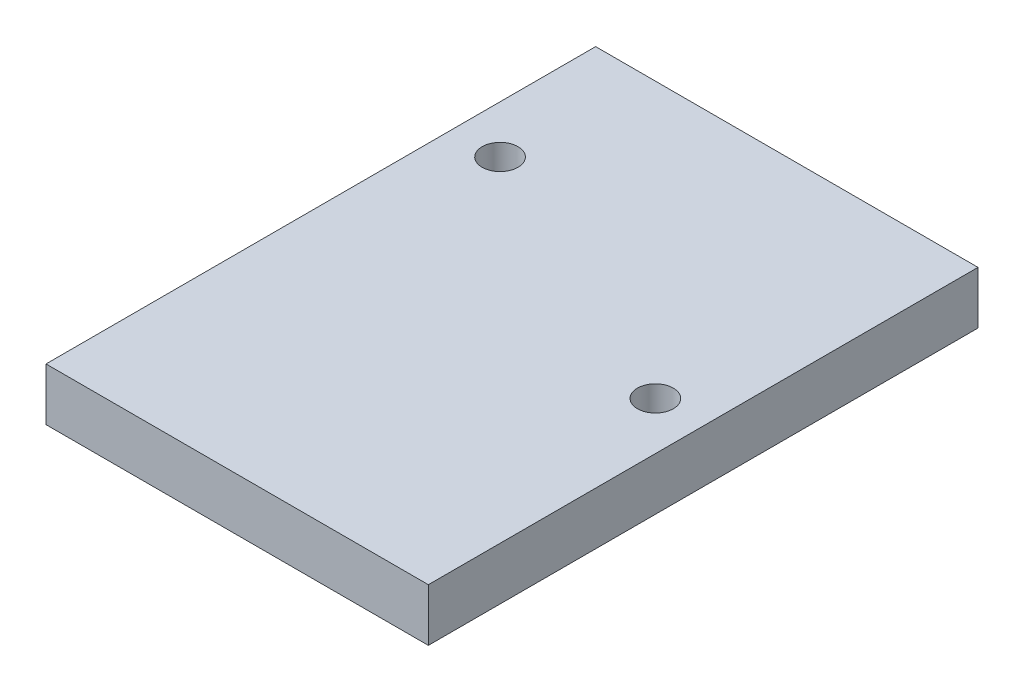
ISO-10303-21;
HEADER;
FILE_DESCRIPTION(('STEP AP214'),'2;1');
FILE_NAME('part.step','',(''),(''),'','','');
FILE_SCHEMA(('AUTOMOTIVE_DESIGN { 1 0 10303 214 1 1 1 1 }'));
ENDSEC;
DATA;
#1=APPLICATION_CONTEXT('core data for automotive mechanical design processes');
#2=APPLICATION_PROTOCOL_DEFINITION('international standard','automotive_design',2000,#1);
#3=PRODUCT_CONTEXT('',#1,'mechanical');
#4=PRODUCT('Part','Part','',(#3));
#5=PRODUCT_RELATED_PRODUCT_CATEGORY('part','',(#4));
#6=PRODUCT_DEFINITION_FORMATION('','',#4);
#7=PRODUCT_DEFINITION_CONTEXT('part definition',#1,'design');
#8=PRODUCT_DEFINITION('design','',#6,#7);
#9=PRODUCT_DEFINITION_SHAPE('','',#8);
#10=(LENGTH_UNIT() NAMED_UNIT(*) SI_UNIT(.MILLI.,.METRE.));
#11=(NAMED_UNIT(*) PLANE_ANGLE_UNIT() SI_UNIT($,.RADIAN.));
#12=(NAMED_UNIT(*) SI_UNIT($,.STERADIAN.) SOLID_ANGLE_UNIT());
#13=UNCERTAINTY_MEASURE_WITH_UNIT(LENGTH_MEASURE(1.E-05),#10,'distance_accuracy_value','');
#14=(GEOMETRIC_REPRESENTATION_CONTEXT(3) GLOBAL_UNCERTAINTY_ASSIGNED_CONTEXT((#13)) GLOBAL_UNIT_ASSIGNED_CONTEXT((#10,
#11,#12)) REPRESENTATION_CONTEXT('',''));
#15=CARTESIAN_POINT('',(0.,0.,0.));
#16=DIRECTION('',(0.,0.,1.));
#17=DIRECTION('',(1.,0.,0.));
#18=AXIS2_PLACEMENT_3D('',#15,#16,#17);
#19=CARTESIAN_POINT('',(0.,2.2,0.));
#20=DIRECTION('',(0.,-1.,0.));
#21=DIRECTION('',(0.,0.,-1.));
#22=AXIS2_PLACEMENT_3D('',#19,#20,#21);
#23=PLANE('',#22);
#24=DIRECTION('',(1.,0.,0.));
#25=VECTOR('',#24,1.);
#26=CARTESIAN_POINT('',(0.,2.2,0.));
#27=LINE('',#26,#25);
#28=CARTESIAN_POINT('',(0.,2.2,0.));
#29=VERTEX_POINT('',#28);
#30=CARTESIAN_POINT('',(16.,2.2,0.));
#31=VERTEX_POINT('',#30);
#32=EDGE_CURVE('E130',#29,#31,#27,.T.);
#33=ORIENTED_EDGE('',*,*,#32,.F.);
#34=DIRECTION('',(0.,0.,1.));
#35=VECTOR('',#34,1.);
#36=CARTESIAN_POINT('',(0.,2.2,0.));
#37=LINE('',#36,#35);
#38=CARTESIAN_POINT('',(0.,2.2,23.));
#39=VERTEX_POINT('',#38);
#40=EDGE_CURVE('E120',#29,#39,#37,.T.);
#41=ORIENTED_EDGE('',*,*,#40,.T.);
#42=DIRECTION('',(1.,0.,0.));
#43=VECTOR('',#42,1.);
#44=CARTESIAN_POINT('',(0.,2.2,23.));
#45=LINE('',#44,#43);
#46=CARTESIAN_POINT('',(16.,2.2,23.));
#47=VERTEX_POINT('',#46);
#48=EDGE_CURVE('E115',#39,#47,#45,.T.);
#49=ORIENTED_EDGE('',*,*,#48,.T.);
#50=DIRECTION('',(0.,0.,1.));
#51=VECTOR('',#50,1.);
#52=CARTESIAN_POINT('',(16.,2.2,0.));
#53=LINE('',#52,#51);
#54=EDGE_CURVE('E119',#31,#47,#53,.T.);
#55=ORIENTED_EDGE('',*,*,#54,.F.);
#56=EDGE_LOOP('',(#33,#41,#49,#55));
#57=FACE_BOUND('',#56,.T.);
#58=CARTESIAN_POINT('',(2.,2.2,6.));
#59=DIRECTION('',(0.,1.,0.));
#60=DIRECTION('',(0.,0.,1.));
#61=AXIS2_PLACEMENT_3D('',#58,#59,#60);
#62=CIRCLE('',#61,0.75);
#63=CARTESIAN_POINT('',(2.,2.2,6.75));
#64=VERTEX_POINT('',#63);
#65=EDGE_CURVE('E140',#64,#64,#62,.T.);
#66=ORIENTED_EDGE('',*,*,#65,.F.);
#67=EDGE_LOOP('',(#66));
#68=FACE_BOUND('',#67,.T.);
#69=CARTESIAN_POINT('',(14.,2.2,11.5));
#70=DIRECTION('',(0.,1.,0.));
#71=DIRECTION('',(0.,0.,1.));
#72=AXIS2_PLACEMENT_3D('',#69,#70,#71);
#73=CIRCLE('',#72,0.75);
#74=CARTESIAN_POINT('',(14.,2.2,12.25));
#75=VERTEX_POINT('',#74);
#76=EDGE_CURVE('E181',#75,#75,#73,.T.);
#77=ORIENTED_EDGE('',*,*,#76,.F.);
#78=EDGE_LOOP('',(#77));
#79=FACE_BOUND('',#78,.T.);
#80=ADVANCED_FACE('F69',(#57,#68,#79),#23,.F.);
#81=CARTESIAN_POINT('',(0.,0.,0.));
#82=DIRECTION('',(0.,-1.,0.));
#83=DIRECTION('',(0.,0.,-1.));
#84=AXIS2_PLACEMENT_3D('',#81,#82,#83);
#85=PLANE('',#84);
#86=CARTESIAN_POINT('',(2.,0.,6.));
#87=DIRECTION('',(0.,1.,0.));
#88=DIRECTION('',(0.,0.,1.));
#89=AXIS2_PLACEMENT_3D('',#86,#87,#88);
#90=CIRCLE('',#89,0.75);
#91=CARTESIAN_POINT('',(2.,0.,6.75));
#92=VERTEX_POINT('',#91);
#93=EDGE_CURVE('E180',#92,#92,#90,.T.);
#94=ORIENTED_EDGE('',*,*,#93,.T.);
#95=EDGE_LOOP('',(#94));
#96=FACE_BOUND('',#95,.T.);
#97=DIRECTION('',(1.,0.,0.));
#98=VECTOR('',#97,1.);
#99=CARTESIAN_POINT('',(0.,0.,0.));
#100=LINE('',#99,#98);
#101=CARTESIAN_POINT('',(0.,0.,0.));
#102=VERTEX_POINT('',#101);
#103=CARTESIAN_POINT('',(16.,0.,0.));
#104=VERTEX_POINT('',#103);
#105=EDGE_CURVE('E136',#102,#104,#100,.T.);
#106=ORIENTED_EDGE('',*,*,#105,.T.);
#107=DIRECTION('',(0.,0.,1.));
#108=VECTOR('',#107,1.);
#109=CARTESIAN_POINT('',(16.,0.,0.));
#110=LINE('',#109,#108);
#111=CARTESIAN_POINT('',(16.,0.,23.));
#112=VERTEX_POINT('',#111);
#113=EDGE_CURVE('E139',#104,#112,#110,.T.);
#114=ORIENTED_EDGE('',*,*,#113,.T.);
#115=DIRECTION('',(1.,0.,0.));
#116=VECTOR('',#115,1.);
#117=CARTESIAN_POINT('',(0.,0.,23.));
#118=LINE('',#117,#116);
#119=CARTESIAN_POINT('',(0.,0.,23.));
#120=VERTEX_POINT('',#119);
#121=EDGE_CURVE('E127',#120,#112,#118,.T.);
#122=ORIENTED_EDGE('',*,*,#121,.F.);
#123=DIRECTION('',(0.,0.,1.));
#124=VECTOR('',#123,1.);
#125=CARTESIAN_POINT('',(0.,0.,0.));
#126=LINE('',#125,#124);
#127=EDGE_CURVE('E103',#102,#120,#126,.T.);
#128=ORIENTED_EDGE('',*,*,#127,.F.);
#129=EDGE_LOOP('',(#106,#114,#122,#128));
#130=FACE_BOUND('',#129,.T.);
#131=CARTESIAN_POINT('',(14.,0.,11.5));
#132=DIRECTION('',(0.,1.,0.));
#133=DIRECTION('',(0.,0.,1.));
#134=AXIS2_PLACEMENT_3D('',#131,#132,#133);
#135=CIRCLE('',#134,0.75);
#136=CARTESIAN_POINT('',(14.,0.,12.25));
#137=VERTEX_POINT('',#136);
#138=EDGE_CURVE('E184',#137,#137,#135,.T.);
#139=ORIENTED_EDGE('',*,*,#138,.T.);
#140=EDGE_LOOP('',(#139));
#141=FACE_BOUND('',#140,.T.);
#142=ADVANCED_FACE('F145',(#96,#130,#141),#85,.T.);
#143=CARTESIAN_POINT('',(0.,2.2,0.));
#144=DIRECTION('',(0.,0.,-1.));
#145=DIRECTION('',(-1.,0.,0.));
#146=AXIS2_PLACEMENT_3D('',#143,#144,#145);
#147=PLANE('',#146);
#148=ORIENTED_EDGE('',*,*,#105,.F.);
#149=DIRECTION('',(0.,-1.,0.));
#150=VECTOR('',#149,1.);
#151=CARTESIAN_POINT('',(0.,2.2,0.));
#152=LINE('',#151,#150);
#153=EDGE_CURVE('E12',#29,#102,#152,.T.);
#154=ORIENTED_EDGE('',*,*,#153,.F.);
#155=ORIENTED_EDGE('',*,*,#32,.T.);
#156=DIRECTION('',(0.,-1.,0.));
#157=VECTOR('',#156,1.);
#158=CARTESIAN_POINT('',(16.,2.2,0.));
#159=LINE('',#158,#157);
#160=EDGE_CURVE('E73',#31,#104,#159,.T.);
#161=ORIENTED_EDGE('',*,*,#160,.T.);
#162=EDGE_LOOP('',(#148,#154,#155,#161));
#163=FACE_BOUND('',#162,.T.);
#164=ADVANCED_FACE('F71',(#163),#147,.T.);
#165=CARTESIAN_POINT('',(0.,2.2,0.));
#166=DIRECTION('',(1.,0.,0.));
#167=DIRECTION('',(0.,0.,-1.));
#168=AXIS2_PLACEMENT_3D('',#165,#166,#167);
#169=PLANE('',#168);
#170=ORIENTED_EDGE('',*,*,#127,.T.);
#171=DIRECTION('',(0.,-1.,0.));
#172=VECTOR('',#171,1.);
#173=CARTESIAN_POINT('',(0.,2.2,23.));
#174=LINE('',#173,#172);
#175=EDGE_CURVE('E79',#39,#120,#174,.T.);
#176=ORIENTED_EDGE('',*,*,#175,.F.);
#177=ORIENTED_EDGE('',*,*,#40,.F.);
#178=ORIENTED_EDGE('',*,*,#153,.T.);
#179=EDGE_LOOP('',(#170,#176,#177,#178));
#180=FACE_BOUND('',#179,.T.);
#181=ADVANCED_FACE('F148',(#180),#169,.F.);
#182=CARTESIAN_POINT('',(0.,2.2,23.));
#183=DIRECTION('',(0.,0.,-1.));
#184=DIRECTION('',(-1.,0.,0.));
#185=AXIS2_PLACEMENT_3D('',#182,#183,#184);
#186=PLANE('',#185);
#187=ORIENTED_EDGE('',*,*,#121,.T.);
#188=DIRECTION('',(0.,-1.,0.));
#189=VECTOR('',#188,1.);
#190=CARTESIAN_POINT('',(16.,2.2,23.));
#191=LINE('',#190,#189);
#192=EDGE_CURVE('E124',#47,#112,#191,.T.);
#193=ORIENTED_EDGE('',*,*,#192,.F.);
#194=ORIENTED_EDGE('',*,*,#48,.F.);
#195=ORIENTED_EDGE('',*,*,#175,.T.);
#196=EDGE_LOOP('',(#187,#193,#194,#195));
#197=FACE_BOUND('',#196,.T.);
#198=ADVANCED_FACE('F125',(#197),#186,.F.);
#199=CARTESIAN_POINT('',(16.,2.2,0.));
#200=DIRECTION('',(1.,0.,0.));
#201=DIRECTION('',(0.,0.,-1.));
#202=AXIS2_PLACEMENT_3D('',#199,#200,#201);
#203=PLANE('',#202);
#204=ORIENTED_EDGE('',*,*,#113,.F.);
#205=ORIENTED_EDGE('',*,*,#160,.F.);
#206=ORIENTED_EDGE('',*,*,#54,.T.);
#207=ORIENTED_EDGE('',*,*,#192,.T.);
#208=EDGE_LOOP('',(#204,#205,#206,#207));
#209=FACE_BOUND('',#208,.T.);
#210=ADVANCED_FACE('F129',(#209),#203,.T.);
#211=CARTESIAN_POINT('',(2.,2.2,6.));
#212=DIRECTION('',(0.,-1.,0.));
#213=DIRECTION('',(0.,0.,-1.));
#214=AXIS2_PLACEMENT_3D('',#211,#212,#213);
#215=CYLINDRICAL_SURFACE('',#214,0.75);
#216=ORIENTED_EDGE('',*,*,#65,.T.);
#217=EDGE_LOOP('',(#216));
#218=FACE_BOUND('',#217,.T.);
#219=ORIENTED_EDGE('',*,*,#93,.F.);
#220=EDGE_LOOP('',(#219));
#221=FACE_BOUND('',#220,.T.);
#222=ADVANCED_FACE('F161',(#218,#221),#215,.F.);
#223=CARTESIAN_POINT('',(14.,2.2,11.5));
#224=DIRECTION('',(0.,-1.,0.));
#225=DIRECTION('',(0.,0.,-1.));
#226=AXIS2_PLACEMENT_3D('',#223,#224,#225);
#227=CYLINDRICAL_SURFACE('',#226,0.75);
#228=ORIENTED_EDGE('',*,*,#76,.T.);
#229=EDGE_LOOP('',(#228));
#230=FACE_BOUND('',#229,.T.);
#231=ORIENTED_EDGE('',*,*,#138,.F.);
#232=EDGE_LOOP('',(#231));
#233=FACE_BOUND('',#232,.T.);
#234=ADVANCED_FACE('F169',(#230,#233),#227,.F.);
#235=CLOSED_SHELL('',(#80,#142,#164,#181,#198,#210,#222,#234));
#236=MANIFOLD_SOLID_BREP('B2',#235);
#237=ADVANCED_BREP_SHAPE_REPRESENTATION('',(#18,#236),#14);
#238=SHAPE_DEFINITION_REPRESENTATION(#9,#237);
ENDSEC;
END-ISO-10303-21;
